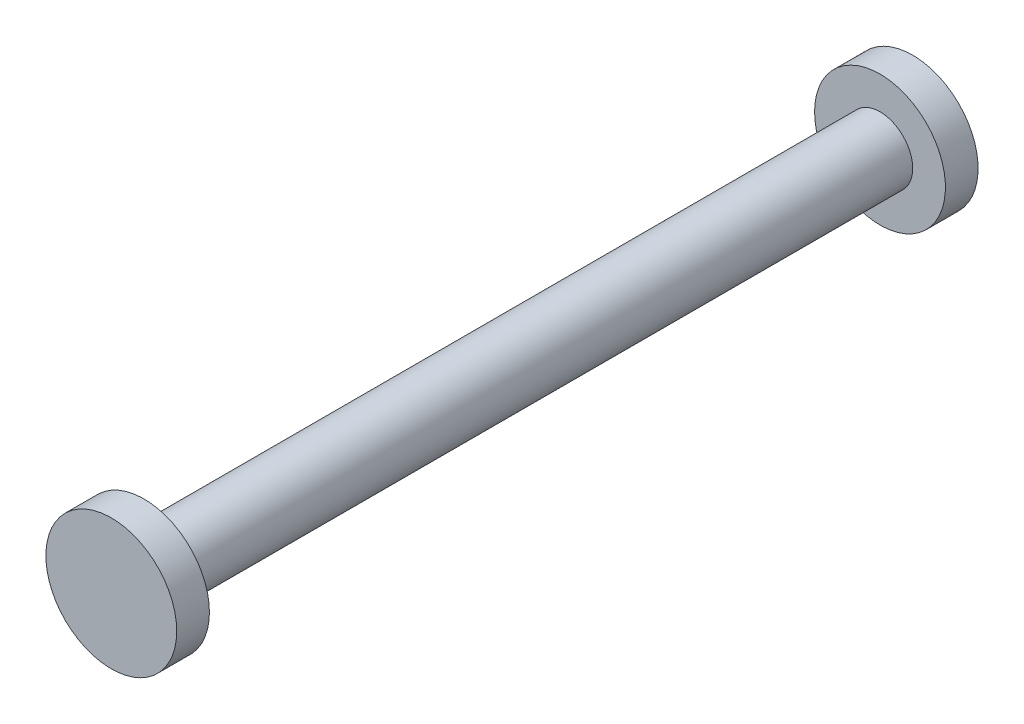
ISO-10303-21;
HEADER;
FILE_DESCRIPTION(('STEP AP214'),'2;1');
FILE_NAME('part.step','',(''),(''),'','','');
FILE_SCHEMA(('AUTOMOTIVE_DESIGN { 1 0 10303 214 1 1 1 1 }'));
ENDSEC;
DATA;
#1=APPLICATION_CONTEXT('core data for automotive mechanical design processes');
#2=APPLICATION_PROTOCOL_DEFINITION('international standard','automotive_design',2000,#1);
#3=PRODUCT_CONTEXT('',#1,'mechanical');
#4=PRODUCT('Part','Part','',(#3));
#5=PRODUCT_RELATED_PRODUCT_CATEGORY('part','',(#4));
#6=PRODUCT_DEFINITION_FORMATION('','',#4);
#7=PRODUCT_DEFINITION_CONTEXT('part definition',#1,'design');
#8=PRODUCT_DEFINITION('design','',#6,#7);
#9=PRODUCT_DEFINITION_SHAPE('','',#8);
#10=(LENGTH_UNIT() NAMED_UNIT(*) SI_UNIT(.MILLI.,.METRE.));
#11=(NAMED_UNIT(*) PLANE_ANGLE_UNIT() SI_UNIT($,.RADIAN.));
#12=(NAMED_UNIT(*) SI_UNIT($,.STERADIAN.) SOLID_ANGLE_UNIT());
#13=UNCERTAINTY_MEASURE_WITH_UNIT(LENGTH_MEASURE(1.E-05),#10,'distance_accuracy_value','');
#14=(GEOMETRIC_REPRESENTATION_CONTEXT(3) GLOBAL_UNCERTAINTY_ASSIGNED_CONTEXT((#13)) GLOBAL_UNIT_ASSIGNED_CONTEXT((#10,
#11,#12)) REPRESENTATION_CONTEXT('',''));
#15=CARTESIAN_POINT('',(0.,0.,0.));
#16=DIRECTION('',(0.,0.,1.));
#17=DIRECTION('',(1.,0.,0.));
#18=AXIS2_PLACEMENT_3D('',#15,#16,#17);
#19=CARTESIAN_POINT('',(0.,0.,57.15));
#20=DIRECTION('',(0.,0.,-1.));
#21=DIRECTION('',(-1.,0.,0.));
#22=AXIS2_PLACEMENT_3D('',#19,#20,#21);
#23=CYLINDRICAL_SURFACE('',#22,2.54);
#24=CARTESIAN_POINT('',(0.,0.,57.15));
#25=DIRECTION('',(0.,0.,1.));
#26=DIRECTION('',(1.,0.,0.));
#27=AXIS2_PLACEMENT_3D('',#24,#25,#26);
#28=CIRCLE('',#27,2.54);
#29=CARTESIAN_POINT('',(2.54,0.,57.15));
#30=VERTEX_POINT('',#29);
#31=EDGE_CURVE('E10',#30,#30,#28,.T.);
#32=ORIENTED_EDGE('',*,*,#31,.F.);
#33=EDGE_LOOP('',(#32));
#34=FACE_BOUND('',#33,.T.);
#35=CARTESIAN_POINT('',(0.,0.,0.));
#36=DIRECTION('',(0.,0.,-1.));
#37=DIRECTION('',(-1.,0.,0.));
#38=AXIS2_PLACEMENT_3D('',#35,#36,#37);
#39=CIRCLE('',#38,2.54);
#40=CARTESIAN_POINT('',(-2.54,0.,0.));
#41=VERTEX_POINT('',#40);
#42=EDGE_CURVE('E48',#41,#41,#39,.T.);
#43=ORIENTED_EDGE('',*,*,#42,.F.);
#44=EDGE_LOOP('',(#43));
#45=FACE_BOUND('',#44,.T.);
#46=ADVANCED_FACE('F33',(#34,#45),#23,.T.);
#47=CARTESIAN_POINT('',(0.,0.,59.69));
#48=DIRECTION('',(0.,0.,-1.));
#49=DIRECTION('',(-1.,0.,0.));
#50=AXIS2_PLACEMENT_3D('',#47,#48,#49);
#51=CYLINDRICAL_SURFACE('',#50,5.08);
#52=CARTESIAN_POINT('',(0.,0.,59.69));
#53=DIRECTION('',(0.,0.,1.));
#54=DIRECTION('',(1.,0.,0.));
#55=AXIS2_PLACEMENT_3D('',#52,#53,#54);
#56=CIRCLE('',#55,5.08);
#57=CARTESIAN_POINT('',(5.08,0.,59.69));
#58=VERTEX_POINT('',#57);
#59=EDGE_CURVE('E39',#58,#58,#56,.T.);
#60=ORIENTED_EDGE('',*,*,#59,.F.);
#61=EDGE_LOOP('',(#60));
#62=FACE_BOUND('',#61,.T.);
#63=CARTESIAN_POINT('',(0.,0.,57.15));
#64=DIRECTION('',(0.,0.,1.));
#65=DIRECTION('',(1.,0.,0.));
#66=AXIS2_PLACEMENT_3D('',#63,#64,#65);
#67=CIRCLE('',#66,5.08);
#68=CARTESIAN_POINT('',(5.08,0.,57.15));
#69=VERTEX_POINT('',#68);
#70=EDGE_CURVE('E43',#69,#69,#67,.T.);
#71=ORIENTED_EDGE('',*,*,#70,.T.);
#72=EDGE_LOOP('',(#71));
#73=FACE_BOUND('',#72,.T.);
#74=ADVANCED_FACE('F77',(#62,#73),#51,.T.);
#75=CARTESIAN_POINT('',(0.,0.,59.69));
#76=DIRECTION('',(0.,0.,1.));
#77=DIRECTION('',(1.,0.,0.));
#78=AXIS2_PLACEMENT_3D('',#75,#76,#77);
#79=PLANE('',#78);
#80=ORIENTED_EDGE('',*,*,#59,.T.);
#81=EDGE_LOOP('',(#80));
#82=FACE_BOUND('',#81,.T.);
#83=ADVANCED_FACE('F82',(#82),#79,.T.);
#84=CARTESIAN_POINT('',(0.,0.,57.15));
#85=DIRECTION('',(0.,0.,1.));
#86=DIRECTION('',(1.,0.,0.));
#87=AXIS2_PLACEMENT_3D('',#84,#85,#86);
#88=PLANE('',#87);
#89=ORIENTED_EDGE('',*,*,#31,.T.);
#90=EDGE_LOOP('',(#89));
#91=FACE_BOUND('',#90,.T.);
#92=ORIENTED_EDGE('',*,*,#70,.F.);
#93=EDGE_LOOP('',(#92));
#94=FACE_BOUND('',#93,.T.);
#95=ADVANCED_FACE('F64',(#91,#94),#88,.F.);
#96=CARTESIAN_POINT('',(0.,0.,-2.54));
#97=DIRECTION('',(0.,0.,1.));
#98=DIRECTION('',(1.,0.,0.));
#99=AXIS2_PLACEMENT_3D('',#96,#97,#98);
#100=CYLINDRICAL_SURFACE('',#99,5.08);
#101=CARTESIAN_POINT('',(0.,0.,-2.54));
#102=DIRECTION('',(0.,0.,-1.));
#103=DIRECTION('',(-1.,0.,0.));
#104=AXIS2_PLACEMENT_3D('',#101,#102,#103);
#105=CIRCLE('',#104,5.08);
#106=CARTESIAN_POINT('',(-5.08,0.,-2.54));
#107=VERTEX_POINT('',#106);
#108=EDGE_CURVE('E52',#107,#107,#105,.T.);
#109=ORIENTED_EDGE('',*,*,#108,.F.);
#110=EDGE_LOOP('',(#109));
#111=FACE_BOUND('',#110,.T.);
#112=CARTESIAN_POINT('',(0.,0.,0.));
#113=DIRECTION('',(0.,0.,-1.));
#114=DIRECTION('',(-1.,0.,0.));
#115=AXIS2_PLACEMENT_3D('',#112,#113,#114);
#116=CIRCLE('',#115,5.08);
#117=CARTESIAN_POINT('',(-5.08,0.,0.));
#118=VERTEX_POINT('',#117);
#119=EDGE_CURVE('E53',#118,#118,#116,.T.);
#120=ORIENTED_EDGE('',*,*,#119,.T.);
#121=EDGE_LOOP('',(#120));
#122=FACE_BOUND('',#121,.T.);
#123=ADVANCED_FACE('F61',(#111,#122),#100,.T.);
#124=CARTESIAN_POINT('',(0.,0.,-2.54));
#125=DIRECTION('',(0.,0.,-1.));
#126=DIRECTION('',(-1.,0.,0.));
#127=AXIS2_PLACEMENT_3D('',#124,#125,#126);
#128=PLANE('',#127);
#129=ORIENTED_EDGE('',*,*,#108,.T.);
#130=EDGE_LOOP('',(#129));
#131=FACE_BOUND('',#130,.T.);
#132=ADVANCED_FACE('F59',(#131),#128,.T.);
#133=CARTESIAN_POINT('',(0.,0.,0.));
#134=DIRECTION('',(0.,0.,-1.));
#135=DIRECTION('',(-1.,0.,0.));
#136=AXIS2_PLACEMENT_3D('',#133,#134,#135);
#137=PLANE('',#136);
#138=ORIENTED_EDGE('',*,*,#42,.T.);
#139=EDGE_LOOP('',(#138));
#140=FACE_BOUND('',#139,.T.);
#141=ORIENTED_EDGE('',*,*,#119,.F.);
#142=EDGE_LOOP('',(#141));
#143=FACE_BOUND('',#142,.T.);
#144=ADVANCED_FACE('F68',(#140,#143),#137,.F.);
#145=CLOSED_SHELL('',(#46,#74,#83,#95,#123,#132,#144));
#146=MANIFOLD_SOLID_BREP('B2',#145);
#147=ADVANCED_BREP_SHAPE_REPRESENTATION('',(#18,#146),#14);
#148=SHAPE_DEFINITION_REPRESENTATION(#9,#147);
ENDSEC;
END-ISO-10303-21;
